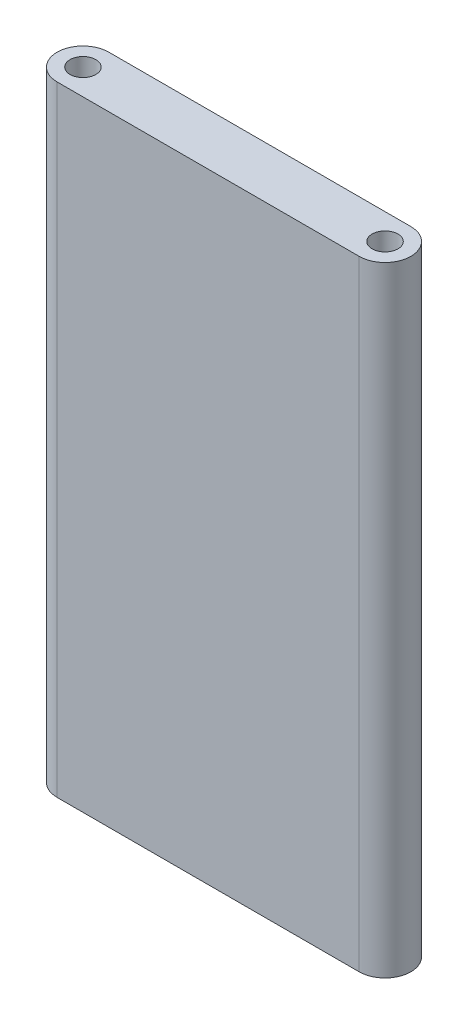
ISO-10303-21;
HEADER;
FILE_DESCRIPTION(('STEP AP214'),'2;1');
FILE_NAME('part.step','',(''),(''),'','','');
FILE_SCHEMA(('AUTOMOTIVE_DESIGN { 1 0 10303 214 1 1 1 1 }'));
ENDSEC;
DATA;
#1=APPLICATION_CONTEXT('core data for automotive mechanical design processes');
#2=APPLICATION_PROTOCOL_DEFINITION('international standard','automotive_design',2000,#1);
#3=PRODUCT_CONTEXT('',#1,'mechanical');
#4=PRODUCT('Part','Part','',(#3));
#5=PRODUCT_RELATED_PRODUCT_CATEGORY('part','',(#4));
#6=PRODUCT_DEFINITION_FORMATION('','',#4);
#7=PRODUCT_DEFINITION_CONTEXT('part definition',#1,'design');
#8=PRODUCT_DEFINITION('design','',#6,#7);
#9=PRODUCT_DEFINITION_SHAPE('','',#8);
#10=(LENGTH_UNIT() NAMED_UNIT(*) SI_UNIT(.MILLI.,.METRE.));
#11=(NAMED_UNIT(*) PLANE_ANGLE_UNIT() SI_UNIT($,.RADIAN.));
#12=(NAMED_UNIT(*) SI_UNIT($,.STERADIAN.) SOLID_ANGLE_UNIT());
#13=UNCERTAINTY_MEASURE_WITH_UNIT(LENGTH_MEASURE(1.E-05),#10,'distance_accuracy_value','');
#14=(GEOMETRIC_REPRESENTATION_CONTEXT(3) GLOBAL_UNCERTAINTY_ASSIGNED_CONTEXT((#13)) GLOBAL_UNIT_ASSIGNED_CONTEXT((#10,
#11,#12)) REPRESENTATION_CONTEXT('',''));
#15=CARTESIAN_POINT('',(0.,0.,0.));
#16=DIRECTION('',(0.,0.,1.));
#17=DIRECTION('',(1.,0.,0.));
#18=AXIS2_PLACEMENT_3D('',#15,#16,#17);
#19=CARTESIAN_POINT('',(-37.1475,152.4,0.));
#20=DIRECTION('',(0.,1.,0.));
#21=DIRECTION('',(0.,0.,1.));
#22=AXIS2_PLACEMENT_3D('',#19,#20,#21);
#23=PLANE('',#22);
#24=CARTESIAN_POINT('',(37.1475,152.4,0.));
#25=DIRECTION('',(0.,1.,0.));
#26=DIRECTION('',(0.,0.,1.));
#27=AXIS2_PLACEMENT_3D('',#24,#25,#26);
#28=CIRCLE('',#27,3.175);
#29=CARTESIAN_POINT('',(37.1475,152.4,-3.175));
#30=VERTEX_POINT('',#29);
#31=EDGE_CURVE('E118',#30,#30,#28,.T.);
#32=ORIENTED_EDGE('',*,*,#31,.F.);
#33=EDGE_LOOP('',(#32));
#34=FACE_BOUND('',#33,.T.);
#35=CARTESIAN_POINT('',(-37.1475,152.4,0.));
#36=DIRECTION('',(0.,1.,0.));
#37=DIRECTION('',(0.,0.,1.));
#38=AXIS2_PLACEMENT_3D('',#35,#36,#37);
#39=CIRCLE('',#38,6.35);
#40=CARTESIAN_POINT('',(-37.1475,152.4,-6.35));
#41=VERTEX_POINT('',#40);
#42=CARTESIAN_POINT('',(-37.1475,152.4,6.35));
#43=VERTEX_POINT('',#42);
#44=EDGE_CURVE('E98',#41,#43,#39,.T.);
#45=ORIENTED_EDGE('',*,*,#44,.T.);
#46=DIRECTION('',(1.,0.,0.));
#47=VECTOR('',#46,1.);
#48=CARTESIAN_POINT('',(-37.1475,152.4,6.35));
#49=LINE('',#48,#47);
#50=CARTESIAN_POINT('',(37.1475,152.4,6.35));
#51=VERTEX_POINT('',#50);
#52=EDGE_CURVE('E93',#43,#51,#49,.T.);
#53=ORIENTED_EDGE('',*,*,#52,.T.);
#54=CARTESIAN_POINT('',(37.1475,152.4,0.));
#55=DIRECTION('',(0.,1.,0.));
#56=DIRECTION('',(0.,0.,1.));
#57=AXIS2_PLACEMENT_3D('',#54,#55,#56);
#58=CIRCLE('',#57,6.35);
#59=CARTESIAN_POINT('',(37.1475,152.4,-6.35));
#60=VERTEX_POINT('',#59);
#61=EDGE_CURVE('E96',#51,#60,#58,.T.);
#62=ORIENTED_EDGE('',*,*,#61,.T.);
#63=DIRECTION('',(-1.,0.,0.));
#64=VECTOR('',#63,1.);
#65=CARTESIAN_POINT('',(-37.1475,152.4,-6.35));
#66=LINE('',#65,#64);
#67=EDGE_CURVE('E63',#60,#41,#66,.T.);
#68=ORIENTED_EDGE('',*,*,#67,.T.);
#69=EDGE_LOOP('',(#45,#53,#62,#68));
#70=FACE_BOUND('',#69,.T.);
#71=CARTESIAN_POINT('',(-37.1475,152.4,0.));
#72=DIRECTION('',(0.,1.,0.));
#73=DIRECTION('',(0.,0.,1.));
#74=AXIS2_PLACEMENT_3D('',#71,#72,#73);
#75=CIRCLE('',#74,3.175);
#76=CARTESIAN_POINT('',(-37.1475,152.4,-3.175));
#77=VERTEX_POINT('',#76);
#78=EDGE_CURVE('E140',#77,#77,#75,.T.);
#79=ORIENTED_EDGE('',*,*,#78,.F.);
#80=EDGE_LOOP('',(#79));
#81=FACE_BOUND('',#80,.T.);
#82=ADVANCED_FACE('F45',(#34,#70,#81),#23,.T.);
#83=CARTESIAN_POINT('',(-37.1475,0.,0.));
#84=DIRECTION('',(0.,1.,0.));
#85=DIRECTION('',(0.,0.,1.));
#86=AXIS2_PLACEMENT_3D('',#83,#84,#85);
#87=PLANE('',#86);
#88=CARTESIAN_POINT('',(-37.1475,0.,0.));
#89=DIRECTION('',(0.,1.,0.));
#90=DIRECTION('',(0.,0.,1.));
#91=AXIS2_PLACEMENT_3D('',#88,#89,#90);
#92=CIRCLE('',#91,6.35);
#93=CARTESIAN_POINT('',(-37.1475,0.,-6.35));
#94=VERTEX_POINT('',#93);
#95=CARTESIAN_POINT('',(-37.1475,0.,6.35));
#96=VERTEX_POINT('',#95);
#97=EDGE_CURVE('E114',#94,#96,#92,.T.);
#98=ORIENTED_EDGE('',*,*,#97,.F.);
#99=DIRECTION('',(-1.,0.,0.));
#100=VECTOR('',#99,1.);
#101=CARTESIAN_POINT('',(-37.1475,0.,-6.35));
#102=LINE('',#101,#100);
#103=CARTESIAN_POINT('',(37.1475,0.,-6.35));
#104=VERTEX_POINT('',#103);
#105=EDGE_CURVE('E86',#104,#94,#102,.T.);
#106=ORIENTED_EDGE('',*,*,#105,.F.);
#107=CARTESIAN_POINT('',(37.1475,0.,0.));
#108=DIRECTION('',(0.,1.,0.));
#109=DIRECTION('',(0.,0.,1.));
#110=AXIS2_PLACEMENT_3D('',#107,#108,#109);
#111=CIRCLE('',#110,6.35);
#112=CARTESIAN_POINT('',(37.1475,0.,6.35));
#113=VERTEX_POINT('',#112);
#114=EDGE_CURVE('E80',#113,#104,#111,.T.);
#115=ORIENTED_EDGE('',*,*,#114,.F.);
#116=DIRECTION('',(1.,0.,0.));
#117=VECTOR('',#116,1.);
#118=CARTESIAN_POINT('',(-37.1475,0.,6.35));
#119=LINE('',#118,#117);
#120=EDGE_CURVE('E103',#96,#113,#119,.T.);
#121=ORIENTED_EDGE('',*,*,#120,.F.);
#122=EDGE_LOOP('',(#98,#106,#115,#121));
#123=FACE_BOUND('',#122,.T.);
#124=CARTESIAN_POINT('',(37.1475,0.,0.));
#125=DIRECTION('',(0.,1.,0.));
#126=DIRECTION('',(0.,0.,1.));
#127=AXIS2_PLACEMENT_3D('',#124,#125,#126);
#128=CIRCLE('',#127,3.175);
#129=CARTESIAN_POINT('',(37.1475,0.,-3.175));
#130=VERTEX_POINT('',#129);
#131=EDGE_CURVE('E136',#130,#130,#128,.T.);
#132=ORIENTED_EDGE('',*,*,#131,.T.);
#133=EDGE_LOOP('',(#132));
#134=FACE_BOUND('',#133,.T.);
#135=CARTESIAN_POINT('',(-37.1475,0.,0.));
#136=DIRECTION('',(0.,1.,0.));
#137=DIRECTION('',(0.,0.,1.));
#138=AXIS2_PLACEMENT_3D('',#135,#136,#137);
#139=CIRCLE('',#138,3.175);
#140=CARTESIAN_POINT('',(-37.1475,0.,-3.175));
#141=VERTEX_POINT('',#140);
#142=EDGE_CURVE('E144',#141,#141,#139,.T.);
#143=ORIENTED_EDGE('',*,*,#142,.T.);
#144=EDGE_LOOP('',(#143));
#145=FACE_BOUND('',#144,.T.);
#146=ADVANCED_FACE('F131',(#123,#134,#145),#87,.F.);
#147=CARTESIAN_POINT('',(-37.1475,152.4,0.));
#148=DIRECTION('',(0.,-1.,0.));
#149=DIRECTION('',(0.,0.,-1.));
#150=AXIS2_PLACEMENT_3D('',#147,#148,#149);
#151=CYLINDRICAL_SURFACE('',#150,6.35);
#152=ORIENTED_EDGE('',*,*,#97,.T.);
#153=DIRECTION('',(0.,-1.,0.));
#154=VECTOR('',#153,1.);
#155=CARTESIAN_POINT('',(-37.1475,152.4,6.35));
#156=LINE('',#155,#154);
#157=EDGE_CURVE('E11',#43,#96,#156,.T.);
#158=ORIENTED_EDGE('',*,*,#157,.F.);
#159=ORIENTED_EDGE('',*,*,#44,.F.);
#160=DIRECTION('',(0.,-1.,0.));
#161=VECTOR('',#160,1.);
#162=CARTESIAN_POINT('',(-37.1475,152.4,-6.35));
#163=LINE('',#162,#161);
#164=EDGE_CURVE('E110',#41,#94,#163,.T.);
#165=ORIENTED_EDGE('',*,*,#164,.T.);
#166=EDGE_LOOP('',(#152,#158,#159,#165));
#167=FACE_BOUND('',#166,.T.);
#168=ADVANCED_FACE('F47',(#167),#151,.T.);
#169=CARTESIAN_POINT('',(-37.1475,152.4,6.35));
#170=DIRECTION('',(0.,0.,-1.));
#171=DIRECTION('',(-1.,0.,0.));
#172=AXIS2_PLACEMENT_3D('',#169,#170,#171);
#173=PLANE('',#172);
#174=ORIENTED_EDGE('',*,*,#120,.T.);
#175=DIRECTION('',(0.,-1.,0.));
#176=VECTOR('',#175,1.);
#177=CARTESIAN_POINT('',(37.1475,152.4,6.35));
#178=LINE('',#177,#176);
#179=EDGE_CURVE('E55',#51,#113,#178,.T.);
#180=ORIENTED_EDGE('',*,*,#179,.F.);
#181=ORIENTED_EDGE('',*,*,#52,.F.);
#182=ORIENTED_EDGE('',*,*,#157,.T.);
#183=EDGE_LOOP('',(#174,#180,#181,#182));
#184=FACE_BOUND('',#183,.T.);
#185=ADVANCED_FACE('F102',(#184),#173,.F.);
#186=CARTESIAN_POINT('',(37.1475,152.4,0.));
#187=DIRECTION('',(0.,-1.,0.));
#188=DIRECTION('',(0.,0.,-1.));
#189=AXIS2_PLACEMENT_3D('',#186,#187,#188);
#190=CYLINDRICAL_SURFACE('',#189,6.35);
#191=ORIENTED_EDGE('',*,*,#114,.T.);
#192=DIRECTION('',(0.,-1.,0.));
#193=VECTOR('',#192,1.);
#194=CARTESIAN_POINT('',(37.1475,152.4,-6.35));
#195=LINE('',#194,#193);
#196=EDGE_CURVE('E105',#60,#104,#195,.T.);
#197=ORIENTED_EDGE('',*,*,#196,.F.);
#198=ORIENTED_EDGE('',*,*,#61,.F.);
#199=ORIENTED_EDGE('',*,*,#179,.T.);
#200=EDGE_LOOP('',(#191,#197,#198,#199));
#201=FACE_BOUND('',#200,.T.);
#202=ADVANCED_FACE('F106',(#201),#190,.T.);
#203=CARTESIAN_POINT('',(-37.1475,152.4,-6.35));
#204=DIRECTION('',(0.,0.,1.));
#205=DIRECTION('',(1.,0.,0.));
#206=AXIS2_PLACEMENT_3D('',#203,#204,#205);
#207=PLANE('',#206);
#208=ORIENTED_EDGE('',*,*,#105,.T.);
#209=ORIENTED_EDGE('',*,*,#164,.F.);
#210=ORIENTED_EDGE('',*,*,#67,.F.);
#211=ORIENTED_EDGE('',*,*,#196,.T.);
#212=EDGE_LOOP('',(#208,#209,#210,#211));
#213=FACE_BOUND('',#212,.T.);
#214=ADVANCED_FACE('F128',(#213),#207,.F.);
#215=CARTESIAN_POINT('',(37.1475,152.4,0.));
#216=DIRECTION('',(0.,-1.,0.));
#217=DIRECTION('',(0.,0.,-1.));
#218=AXIS2_PLACEMENT_3D('',#215,#216,#217);
#219=CYLINDRICAL_SURFACE('',#218,3.175);
#220=CARTESIAN_POINT('',(37.1475,152.4,-3.175));
#221=CARTESIAN_POINT('',(37.1475,150.8125,-3.175));
#222=CARTESIAN_POINT('',(37.1475,149.225,-3.175));
#223=CARTESIAN_POINT('',(37.1475,146.05,-3.175));
#224=CARTESIAN_POINT('',(37.1475,144.4625,-3.175));
#225=CARTESIAN_POINT('',(37.1475,141.2875,-3.175));
#226=CARTESIAN_POINT('',(37.1475,139.7,-3.175));
#227=CARTESIAN_POINT('',(37.1475,136.525,-3.175));
#228=CARTESIAN_POINT('',(37.1475,134.9375,-3.175));
#229=CARTESIAN_POINT('',(37.1475,131.7625,-3.175));
#230=CARTESIAN_POINT('',(37.1475,130.175,-3.175));
#231=CARTESIAN_POINT('',(37.1475,127.,-3.175));
#232=CARTESIAN_POINT('',(37.1475,125.4125,-3.175));
#233=CARTESIAN_POINT('',(37.1475,122.2375,-3.175));
#234=CARTESIAN_POINT('',(37.1475,120.65,-3.175));
#235=CARTESIAN_POINT('',(37.1475,117.475,-3.175));
#236=CARTESIAN_POINT('',(37.1475,115.8875,-3.175));
#237=CARTESIAN_POINT('',(37.1475,112.7125,-3.175));
#238=CARTESIAN_POINT('',(37.1475,111.125,-3.175));
#239=CARTESIAN_POINT('',(37.1475,107.95,-3.175));
#240=CARTESIAN_POINT('',(37.1475,106.3625,-3.175));
#241=CARTESIAN_POINT('',(37.1475,103.1875,-3.175));
#242=CARTESIAN_POINT('',(37.1475,101.6,-3.175));
#243=CARTESIAN_POINT('',(37.1475,98.425,-3.175));
#244=CARTESIAN_POINT('',(37.1475,96.8375,-3.175));
#245=CARTESIAN_POINT('',(37.1475,93.6625,-3.175));
#246=CARTESIAN_POINT('',(37.1475,92.075,-3.175));
#247=CARTESIAN_POINT('',(37.1475,88.9,-3.175));
#248=CARTESIAN_POINT('',(37.1475,87.3125,-3.175));
#249=CARTESIAN_POINT('',(37.1475,84.1375,-3.175));
#250=CARTESIAN_POINT('',(37.1475,82.55,-3.175));
#251=CARTESIAN_POINT('',(37.1475,79.375,-3.175));
#252=CARTESIAN_POINT('',(37.1475,77.7875,-3.175));
#253=CARTESIAN_POINT('',(37.1475,74.6125,-3.175));
#254=CARTESIAN_POINT('',(37.1475,73.025,-3.175));
#255=CARTESIAN_POINT('',(37.1475,69.85,-3.175));
#256=CARTESIAN_POINT('',(37.1475,68.2625,-3.175));
#257=CARTESIAN_POINT('',(37.1475,65.0875,-3.175));
#258=CARTESIAN_POINT('',(37.1475,63.5,-3.175));
#259=CARTESIAN_POINT('',(37.1475,60.325,-3.175));
#260=CARTESIAN_POINT('',(37.1475,58.7375,-3.175));
#261=CARTESIAN_POINT('',(37.1475,55.5625,-3.175));
#262=CARTESIAN_POINT('',(37.1475,53.975,-3.175));
#263=CARTESIAN_POINT('',(37.1475,50.8,-3.175));
#264=CARTESIAN_POINT('',(37.1475,49.2125,-3.175));
#265=CARTESIAN_POINT('',(37.1475,46.0375,-3.175));
#266=CARTESIAN_POINT('',(37.1475,44.45,-3.175));
#267=CARTESIAN_POINT('',(37.1475,41.275,-3.175));
#268=CARTESIAN_POINT('',(37.1475,39.6875,-3.175));
#269=CARTESIAN_POINT('',(37.1475,36.5125,-3.175));
#270=CARTESIAN_POINT('',(37.1475,34.925,-3.175));
#271=CARTESIAN_POINT('',(37.1475,31.75,-3.175));
#272=CARTESIAN_POINT('',(37.1475,30.1625,-3.175));
#273=CARTESIAN_POINT('',(37.1475,26.9875,-3.175));
#274=CARTESIAN_POINT('',(37.1475,25.4,-3.175));
#275=CARTESIAN_POINT('',(37.1475,22.225,-3.175));
#276=CARTESIAN_POINT('',(37.1475,20.6375,-3.175));
#277=CARTESIAN_POINT('',(37.1475,17.4625,-3.175));
#278=CARTESIAN_POINT('',(37.1475,15.875,-3.175));
#279=CARTESIAN_POINT('',(37.1475,12.7,-3.175));
#280=CARTESIAN_POINT('',(37.1475,11.1125,-3.175));
#281=CARTESIAN_POINT('',(37.1475,7.93750000000001,-3.175));
#282=CARTESIAN_POINT('',(37.1475,6.35,-3.175));
#283=CARTESIAN_POINT('',(37.1475,3.175,-3.175));
#284=CARTESIAN_POINT('',(37.1475,1.5875,-3.175));
#285=CARTESIAN_POINT('',(37.1475,0.,-3.175));
#286=B_SPLINE_CURVE_WITH_KNOTS('',3,(#220,#221,#222,#223,#224,#225,#226,#227,#228,#229,#230,
#231,#232,#233,#234,#235,#236,#237,#238,#239,#240,#241,#242,#243,#244,#245,#246,#247,#248,#249,
#250,#251,#252,#253,#254,#255,#256,#257,#258,#259,#260,#261,#262,#263,#264,#265,#266,#267,#268,
#269,#270,#271,#272,#273,#274,#275,#276,#277,#278,#279,#280,#281,#282,#283,#284,#285),
.UNSPECIFIED.,.F.,.F.,(4,2,2,2,2,2,2,2,2,2,2,2,2,2,2,2,2,2,2,2,2,2,2,2,2,2,2,2,2,2,2,2,4),(0.,
4.7625,9.52500000000001,14.2875,19.05,23.8125,28.575,33.3375,38.1,42.8625,47.625,52.3875,57.15,
61.9125,66.675,71.4375,76.2,80.9625,85.725,90.4875,95.25,100.0125,104.775,109.5375,114.3,
119.0625,123.825,128.5875,133.35,138.1125,142.875,147.6375,152.4),.UNSPECIFIED.);
#287=EDGE_CURVE('BSEAM163',#30,#130,#286,.T.);
#288=ORIENTED_EDGE('',*,*,#31,.T.);
#289=ORIENTED_EDGE('',*,*,#131,.F.);
#290=ORIENTED_EDGE('',*,*,#287,.T.);
#291=ORIENTED_EDGE('',*,*,#287,.F.);
#292=EDGE_LOOP('',(#288,#290,#289,#291));
#293=FACE_BOUND('',#292,.T.);
#294=ADVANCED_FACE('F163',(#293),#219,.F.);
#295=CARTESIAN_POINT('',(-37.1475,152.4,0.));
#296=DIRECTION('',(0.,-1.,0.));
#297=DIRECTION('',(0.,0.,-1.));
#298=AXIS2_PLACEMENT_3D('',#295,#296,#297);
#299=CYLINDRICAL_SURFACE('',#298,3.175);
#300=CARTESIAN_POINT('',(-37.1475,152.4,-3.175));
#301=CARTESIAN_POINT('',(-37.1475,150.8125,-3.175));
#302=CARTESIAN_POINT('',(-37.1475,149.225,-3.175));
#303=CARTESIAN_POINT('',(-37.1475,146.05,-3.175));
#304=CARTESIAN_POINT('',(-37.1475,144.4625,-3.175));
#305=CARTESIAN_POINT('',(-37.1475,141.2875,-3.175));
#306=CARTESIAN_POINT('',(-37.1475,139.7,-3.175));
#307=CARTESIAN_POINT('',(-37.1475,136.525,-3.175));
#308=CARTESIAN_POINT('',(-37.1475,134.9375,-3.175));
#309=CARTESIAN_POINT('',(-37.1475,131.7625,-3.175));
#310=CARTESIAN_POINT('',(-37.1475,130.175,-3.175));
#311=CARTESIAN_POINT('',(-37.1475,127.,-3.175));
#312=CARTESIAN_POINT('',(-37.1475,125.4125,-3.175));
#313=CARTESIAN_POINT('',(-37.1475,122.2375,-3.175));
#314=CARTESIAN_POINT('',(-37.1475,120.65,-3.175));
#315=CARTESIAN_POINT('',(-37.1475,117.475,-3.175));
#316=CARTESIAN_POINT('',(-37.1475,115.8875,-3.175));
#317=CARTESIAN_POINT('',(-37.1475,112.7125,-3.175));
#318=CARTESIAN_POINT('',(-37.1475,111.125,-3.175));
#319=CARTESIAN_POINT('',(-37.1475,107.95,-3.175));
#320=CARTESIAN_POINT('',(-37.1475,106.3625,-3.175));
#321=CARTESIAN_POINT('',(-37.1475,103.1875,-3.175));
#322=CARTESIAN_POINT('',(-37.1475,101.6,-3.175));
#323=CARTESIAN_POINT('',(-37.1475,98.425,-3.175));
#324=CARTESIAN_POINT('',(-37.1475,96.8375,-3.175));
#325=CARTESIAN_POINT('',(-37.1475,93.6625,-3.175));
#326=CARTESIAN_POINT('',(-37.1475,92.075,-3.175));
#327=CARTESIAN_POINT('',(-37.1475,88.9,-3.175));
#328=CARTESIAN_POINT('',(-37.1475,87.3125,-3.175));
#329=CARTESIAN_POINT('',(-37.1475,84.1375,-3.175));
#330=CARTESIAN_POINT('',(-37.1475,82.55,-3.175));
#331=CARTESIAN_POINT('',(-37.1475,79.375,-3.175));
#332=CARTESIAN_POINT('',(-37.1475,77.7875,-3.175));
#333=CARTESIAN_POINT('',(-37.1475,74.6125,-3.175));
#334=CARTESIAN_POINT('',(-37.1475,73.025,-3.175));
#335=CARTESIAN_POINT('',(-37.1475,69.85,-3.175));
#336=CARTESIAN_POINT('',(-37.1475,68.2625,-3.175));
#337=CARTESIAN_POINT('',(-37.1475,65.0875,-3.175));
#338=CARTESIAN_POINT('',(-37.1475,63.5,-3.175));
#339=CARTESIAN_POINT('',(-37.1475,60.325,-3.175));
#340=CARTESIAN_POINT('',(-37.1475,58.7375,-3.175));
#341=CARTESIAN_POINT('',(-37.1475,55.5625,-3.175));
#342=CARTESIAN_POINT('',(-37.1475,53.975,-3.175));
#343=CARTESIAN_POINT('',(-37.1475,50.8,-3.175));
#344=CARTESIAN_POINT('',(-37.1475,49.2125,-3.175));
#345=CARTESIAN_POINT('',(-37.1475,46.0375,-3.175));
#346=CARTESIAN_POINT('',(-37.1475,44.45,-3.175));
#347=CARTESIAN_POINT('',(-37.1475,41.275,-3.175));
#348=CARTESIAN_POINT('',(-37.1475,39.6875,-3.175));
#349=CARTESIAN_POINT('',(-37.1475,36.5125,-3.175));
#350=CARTESIAN_POINT('',(-37.1475,34.925,-3.175));
#351=CARTESIAN_POINT('',(-37.1475,31.75,-3.175));
#352=CARTESIAN_POINT('',(-37.1475,30.1625,-3.175));
#353=CARTESIAN_POINT('',(-37.1475,26.9875,-3.175));
#354=CARTESIAN_POINT('',(-37.1475,25.4,-3.175));
#355=CARTESIAN_POINT('',(-37.1475,22.225,-3.175));
#356=CARTESIAN_POINT('',(-37.1475,20.6375,-3.175));
#357=CARTESIAN_POINT('',(-37.1475,17.4625,-3.175));
#358=CARTESIAN_POINT('',(-37.1475,15.875,-3.175));
#359=CARTESIAN_POINT('',(-37.1475,12.7,-3.175));
#360=CARTESIAN_POINT('',(-37.1475,11.1125,-3.175));
#361=CARTESIAN_POINT('',(-37.1475,7.93750000000001,-3.175));
#362=CARTESIAN_POINT('',(-37.1475,6.35,-3.175));
#363=CARTESIAN_POINT('',(-37.1475,3.175,-3.175));
#364=CARTESIAN_POINT('',(-37.1475,1.5875,-3.175));
#365=CARTESIAN_POINT('',(-37.1475,0.,-3.175));
#366=B_SPLINE_CURVE_WITH_KNOTS('',3,(#300,#301,#302,#303,#304,#305,#306,#307,#308,#309,#310,
#311,#312,#313,#314,#315,#316,#317,#318,#319,#320,#321,#322,#323,#324,#325,#326,#327,#328,#329,
#330,#331,#332,#333,#334,#335,#336,#337,#338,#339,#340,#341,#342,#343,#344,#345,#346,#347,#348,
#349,#350,#351,#352,#353,#354,#355,#356,#357,#358,#359,#360,#361,#362,#363,#364,#365),
.UNSPECIFIED.,.F.,.F.,(4,2,2,2,2,2,2,2,2,2,2,2,2,2,2,2,2,2,2,2,2,2,2,2,2,2,2,2,2,2,2,2,4),(0.,
4.7625,9.52500000000001,14.2875,19.05,23.8125,28.575,33.3375,38.1,42.8625,47.625,52.3875,57.15,
61.9125,66.675,71.4375,76.2,80.9625,85.725,90.4875,95.25,100.0125,104.775,109.5375,114.3,
119.0625,123.825,128.5875,133.35,138.1125,142.875,147.6375,152.4),.UNSPECIFIED.);
#367=EDGE_CURVE('BSEAM152',#77,#141,#366,.T.);
#368=ORIENTED_EDGE('',*,*,#78,.T.);
#369=ORIENTED_EDGE('',*,*,#142,.F.);
#370=ORIENTED_EDGE('',*,*,#367,.T.);
#371=ORIENTED_EDGE('',*,*,#367,.F.);
#372=EDGE_LOOP('',(#368,#370,#369,#371));
#373=FACE_BOUND('',#372,.T.);
#374=ADVANCED_FACE('F152',(#373),#299,.F.);
#375=CLOSED_SHELL('',(#82,#146,#168,#185,#202,#214,#294,#374));
#376=MANIFOLD_SOLID_BREP('B2',#375);
#377=ADVANCED_BREP_SHAPE_REPRESENTATION('',(#18,#376),#14);
#378=SHAPE_DEFINITION_REPRESENTATION(#9,#377);
ENDSEC;
END-ISO-10303-21;
